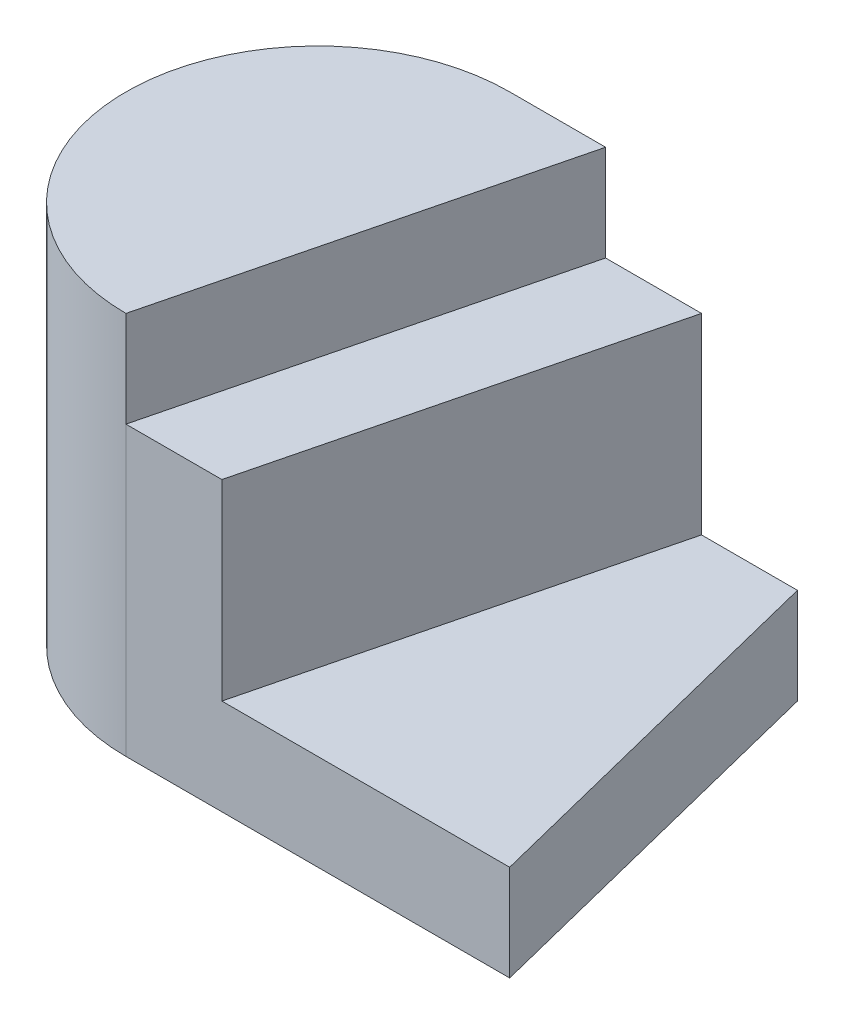
ISO-10303-21;
HEADER;
FILE_DESCRIPTION(('STEP AP214'),'2;1');
FILE_NAME('part.step','',(''),(''),'','','');
FILE_SCHEMA(('AUTOMOTIVE_DESIGN { 1 0 10303 214 1 1 1 1 }'));
ENDSEC;
DATA;
#1=APPLICATION_CONTEXT('core data for automotive mechanical design processes');
#2=APPLICATION_PROTOCOL_DEFINITION('international standard','automotive_design',2000,#1);
#3=PRODUCT_CONTEXT('',#1,'mechanical');
#4=PRODUCT('Part','Part','',(#3));
#5=PRODUCT_RELATED_PRODUCT_CATEGORY('part','',(#4));
#6=PRODUCT_DEFINITION_FORMATION('','',#4);
#7=PRODUCT_DEFINITION_CONTEXT('part definition',#1,'design');
#8=PRODUCT_DEFINITION('design','',#6,#7);
#9=PRODUCT_DEFINITION_SHAPE('','',#8);
#10=(LENGTH_UNIT() NAMED_UNIT(*) SI_UNIT(.MILLI.,.METRE.));
#11=(NAMED_UNIT(*) PLANE_ANGLE_UNIT() SI_UNIT($,.RADIAN.));
#12=(NAMED_UNIT(*) SI_UNIT($,.STERADIAN.) SOLID_ANGLE_UNIT());
#13=UNCERTAINTY_MEASURE_WITH_UNIT(LENGTH_MEASURE(1.E-05),#10,'distance_accuracy_value','');
#14=(GEOMETRIC_REPRESENTATION_CONTEXT(3) GLOBAL_UNCERTAINTY_ASSIGNED_CONTEXT((#13)) GLOBAL_UNIT_ASSIGNED_CONTEXT((#10,
#11,#12)) REPRESENTATION_CONTEXT('',''));
#15=CARTESIAN_POINT('',(0.,0.,0.));
#16=DIRECTION('',(0.,0.,1.));
#17=DIRECTION('',(1.,0.,0.));
#18=AXIS2_PLACEMENT_3D('',#15,#16,#17);
#19=CARTESIAN_POINT('',(-40.,10.,-20.));
#20=DIRECTION('',(0.,1.,0.));
#21=DIRECTION('',(0.,0.,1.));
#22=AXIS2_PLACEMENT_3D('',#19,#20,#21);
#23=PLANE('',#22);
#24=DIRECTION('',(0.242535625036335,0.,-0.970142500145331));
#25=VECTOR('',#24,1.);
#26=CARTESIAN_POINT('',(-30.0000000000001,10.,0.));
#27=LINE('',#26,#25);
#28=CARTESIAN_POINT('',(-30.0000000000001,10.,0.));
#29=VERTEX_POINT('',#28);
#30=CARTESIAN_POINT('',(-20.,10.,-40.));
#31=VERTEX_POINT('',#30);
#32=EDGE_CURVE('E59',#29,#31,#27,.T.);
#33=ORIENTED_EDGE('',*,*,#32,.F.);
#34=DIRECTION('',(1.,0.,0.));
#35=VECTOR('',#34,1.);
#36=CARTESIAN_POINT('',(0.,10.,0.));
#37=LINE('',#36,#35);
#38=CARTESIAN_POINT('',(0.,10.,0.));
#39=VERTEX_POINT('',#38);
#40=EDGE_CURVE('E161',#29,#39,#37,.T.);
#41=ORIENTED_EDGE('',*,*,#40,.T.);
#42=DIRECTION('',(-0.242535625036333,0.,-0.970142500145332));
#43=VECTOR('',#42,1.);
#44=CARTESIAN_POINT('',(0.,10.,0.));
#45=LINE('',#44,#43);
#46=CARTESIAN_POINT('',(-9.99999999999999,10.,-40.));
#47=VERTEX_POINT('',#46);
#48=EDGE_CURVE('E164',#39,#47,#45,.T.);
#49=ORIENTED_EDGE('',*,*,#48,.T.);
#50=DIRECTION('',(-1.,0.,0.));
#51=VECTOR('',#50,1.);
#52=CARTESIAN_POINT('',(-9.99999999999999,10.,-40.));
#53=LINE('',#52,#51);
#54=EDGE_CURVE('E55',#47,#31,#53,.T.);
#55=ORIENTED_EDGE('',*,*,#54,.T.);
#56=EDGE_LOOP('',(#33,#41,#49,#55));
#57=FACE_BOUND('',#56,.T.);
#58=ADVANCED_FACE('F39',(#57),#23,.T.);
#59=CARTESIAN_POINT('',(0.,10.,0.));
#60=DIRECTION('',(0.,0.,-1.));
#61=DIRECTION('',(-1.,0.,0.));
#62=AXIS2_PLACEMENT_3D('',#59,#60,#61);
#63=PLANE('',#62);
#64=DIRECTION('',(1.,0.,0.));
#65=VECTOR('',#64,1.);
#66=CARTESIAN_POINT('',(0.,0.,0.));
#67=LINE('',#66,#65);
#68=CARTESIAN_POINT('',(-40.,0.,0.));
#69=VERTEX_POINT('',#68);
#70=CARTESIAN_POINT('',(0.,0.,0.));
#71=VERTEX_POINT('',#70);
#72=EDGE_CURVE('E160',#69,#71,#67,.T.);
#73=ORIENTED_EDGE('',*,*,#72,.T.);
#74=DIRECTION('',(0.,-1.,0.));
#75=VECTOR('',#74,1.);
#76=CARTESIAN_POINT('',(0.,10.,0.));
#77=LINE('',#76,#75);
#78=EDGE_CURVE('E11',#39,#71,#77,.T.);
#79=ORIENTED_EDGE('',*,*,#78,.F.);
#80=ORIENTED_EDGE('',*,*,#40,.F.);
#81=DIRECTION('',(0.,-1.,0.));
#82=VECTOR('',#81,1.);
#83=CARTESIAN_POINT('',(-30.0000000000001,30.,0.));
#84=LINE('',#83,#82);
#85=CARTESIAN_POINT('',(-30.0000000000001,30.,0.));
#86=VERTEX_POINT('',#85);
#87=EDGE_CURVE('E156',#86,#29,#84,.T.);
#88=ORIENTED_EDGE('',*,*,#87,.F.);
#89=DIRECTION('',(1.,0.,0.));
#90=VECTOR('',#89,1.);
#91=CARTESIAN_POINT('',(-40.,30.,0.));
#92=LINE('',#91,#90);
#93=CARTESIAN_POINT('',(-40.,30.,0.));
#94=VERTEX_POINT('',#93);
#95=EDGE_CURVE('E144',#94,#86,#92,.T.);
#96=ORIENTED_EDGE('',*,*,#95,.F.);
#97=DIRECTION('',(0.,-1.,0.));
#98=VECTOR('',#97,1.);
#99=CARTESIAN_POINT('',(-40.,10.,0.));
#100=LINE('',#99,#98);
#101=EDGE_CURVE('E112',#94,#69,#100,.T.);
#102=ORIENTED_EDGE('',*,*,#101,.T.);
#103=EDGE_LOOP('',(#73,#79,#80,#88,#96,#102));
#104=FACE_BOUND('',#103,.T.);
#105=ADVANCED_FACE('F41',(#104),#63,.F.);
#106=CARTESIAN_POINT('',(0.,10.,0.));
#107=DIRECTION('',(-0.970142500145332,0.,0.242535625036333));
#108=DIRECTION('',(0.242535625036333,0.,0.970142500145332));
#109=AXIS2_PLACEMENT_3D('',#106,#107,#108);
#110=PLANE('',#109);
#111=DIRECTION('',(-0.242535625036333,0.,-0.970142500145332));
#112=VECTOR('',#111,1.);
#113=CARTESIAN_POINT('',(0.,0.,0.));
#114=LINE('',#113,#112);
#115=CARTESIAN_POINT('',(-9.99999999999999,0.,-40.));
#116=VERTEX_POINT('',#115);
#117=EDGE_CURVE('E173',#71,#116,#114,.T.);
#118=ORIENTED_EDGE('',*,*,#117,.T.);
#119=DIRECTION('',(0.,-1.,0.));
#120=VECTOR('',#119,1.);
#121=CARTESIAN_POINT('',(-9.99999999999999,10.,-40.));
#122=LINE('',#121,#120);
#123=EDGE_CURVE('E48',#47,#116,#122,.T.);
#124=ORIENTED_EDGE('',*,*,#123,.F.);
#125=ORIENTED_EDGE('',*,*,#48,.F.);
#126=ORIENTED_EDGE('',*,*,#78,.T.);
#127=EDGE_LOOP('',(#118,#124,#125,#126));
#128=FACE_BOUND('',#127,.T.);
#129=ADVANCED_FACE('F215',(#128),#110,.F.);
#130=CARTESIAN_POINT('',(-9.99999999999999,10.,-40.));
#131=DIRECTION('',(0.,0.,1.));
#132=DIRECTION('',(1.,0.,0.));
#133=AXIS2_PLACEMENT_3D('',#130,#131,#132);
#134=PLANE('',#133);
#135=DIRECTION('',(0.,-1.,0.));
#136=VECTOR('',#135,1.);
#137=CARTESIAN_POINT('',(-40.,10.,-40.));
#138=LINE('',#137,#136);
#139=CARTESIAN_POINT('',(-40.,40.,-40.));
#140=VERTEX_POINT('',#139);
#141=CARTESIAN_POINT('',(-40.,0.,-40.));
#142=VERTEX_POINT('',#141);
#143=EDGE_CURVE('E100',#140,#142,#138,.T.);
#144=ORIENTED_EDGE('',*,*,#143,.F.);
#145=DIRECTION('',(-1.,0.,0.));
#146=VECTOR('',#145,1.);
#147=CARTESIAN_POINT('',(-30.,40.,-40.));
#148=LINE('',#147,#146);
#149=CARTESIAN_POINT('',(-30.,40.,-40.));
#150=VERTEX_POINT('',#149);
#151=EDGE_CURVE('E105',#150,#140,#148,.T.);
#152=ORIENTED_EDGE('',*,*,#151,.F.);
#153=DIRECTION('',(0.,-1.,0.));
#154=VECTOR('',#153,1.);
#155=CARTESIAN_POINT('',(-30.,40.,-40.));
#156=LINE('',#155,#154);
#157=CARTESIAN_POINT('',(-30.,30.,-40.));
#158=VERTEX_POINT('',#157);
#159=EDGE_CURVE('E131',#150,#158,#156,.T.);
#160=ORIENTED_EDGE('',*,*,#159,.T.);
#161=DIRECTION('',(-1.,0.,0.));
#162=VECTOR('',#161,1.);
#163=CARTESIAN_POINT('',(-20.,30.,-40.));
#164=LINE('',#163,#162);
#165=CARTESIAN_POINT('',(-20.,30.,-40.));
#166=VERTEX_POINT('',#165);
#167=EDGE_CURVE('E136',#166,#158,#164,.T.);
#168=ORIENTED_EDGE('',*,*,#167,.F.);
#169=DIRECTION('',(0.,-1.,0.));
#170=VECTOR('',#169,1.);
#171=CARTESIAN_POINT('',(-20.,30.,-40.));
#172=LINE('',#171,#170);
#173=EDGE_CURVE('E150',#166,#31,#172,.T.);
#174=ORIENTED_EDGE('',*,*,#173,.T.);
#175=ORIENTED_EDGE('',*,*,#54,.F.);
#176=ORIENTED_EDGE('',*,*,#123,.T.);
#177=DIRECTION('',(-1.,0.,0.));
#178=VECTOR('',#177,1.);
#179=CARTESIAN_POINT('',(-9.99999999999999,0.,-40.));
#180=LINE('',#179,#178);
#181=EDGE_CURVE('E108',#116,#142,#180,.T.);
#182=ORIENTED_EDGE('',*,*,#181,.T.);
#183=EDGE_LOOP('',(#144,#152,#160,#168,#174,#175,#176,#182));
#184=FACE_BOUND('',#183,.T.);
#185=ADVANCED_FACE('F102',(#184),#134,.F.);
#186=CARTESIAN_POINT('',(-40.,10.,-20.));
#187=DIRECTION('',(0.,-1.,0.));
#188=DIRECTION('',(0.,0.,-1.));
#189=AXIS2_PLACEMENT_3D('',#186,#187,#188);
#190=CYLINDRICAL_SURFACE('',#189,20.);
#191=CARTESIAN_POINT('',(-40.,0.,-20.));
#192=DIRECTION('',(0.,1.,0.));
#193=DIRECTION('',(0.,0.,1.));
#194=AXIS2_PLACEMENT_3D('',#191,#192,#193);
#195=CIRCLE('',#194,20.);
#196=EDGE_CURVE('E165',#142,#69,#195,.T.);
#197=ORIENTED_EDGE('',*,*,#196,.T.);
#198=ORIENTED_EDGE('',*,*,#101,.F.);
#199=DIRECTION('',(0.,-1.,0.));
#200=VECTOR('',#199,1.);
#201=CARTESIAN_POINT('',(-40.,40.,0.));
#202=LINE('',#201,#200);
#203=CARTESIAN_POINT('',(-40.,40.,0.));
#204=VERTEX_POINT('',#203);
#205=EDGE_CURVE('E118',#204,#94,#202,.T.);
#206=ORIENTED_EDGE('',*,*,#205,.F.);
#207=CARTESIAN_POINT('',(-40.,40.,-20.));
#208=DIRECTION('',(0.,1.,0.));
#209=DIRECTION('',(0.,0.,1.));
#210=AXIS2_PLACEMENT_3D('',#207,#208,#209);
#211=CIRCLE('',#210,20.);
#212=EDGE_CURVE('E115',#140,#204,#211,.T.);
#213=ORIENTED_EDGE('',*,*,#212,.F.);
#214=ORIENTED_EDGE('',*,*,#143,.T.);
#215=EDGE_LOOP('',(#197,#198,#206,#213,#214));
#216=FACE_BOUND('',#215,.T.);
#217=ADVANCED_FACE('F116',(#216),#190,.T.);
#218=CARTESIAN_POINT('',(-40.,0.,-20.));
#219=DIRECTION('',(0.,1.,0.));
#220=DIRECTION('',(0.,0.,1.));
#221=AXIS2_PLACEMENT_3D('',#218,#219,#220);
#222=PLANE('',#221);
#223=ORIENTED_EDGE('',*,*,#72,.F.);
#224=ORIENTED_EDGE('',*,*,#196,.F.);
#225=ORIENTED_EDGE('',*,*,#181,.F.);
#226=ORIENTED_EDGE('',*,*,#117,.F.);
#227=EDGE_LOOP('',(#223,#224,#225,#226));
#228=FACE_BOUND('',#227,.T.);
#229=ADVANCED_FACE('F188',(#228),#222,.F.);
#230=CARTESIAN_POINT('',(-30.0000000000001,30.,0.));
#231=DIRECTION('',(-0.970142500145331,0.,-0.242535625036335));
#232=DIRECTION('',(-0.242535625036335,0.,0.970142500145332));
#233=AXIS2_PLACEMENT_3D('',#230,#231,#232);
#234=PLANE('',#233);
#235=ORIENTED_EDGE('',*,*,#32,.T.);
#236=ORIENTED_EDGE('',*,*,#173,.F.);
#237=DIRECTION('',(0.242535625036335,0.,-0.970142500145331));
#238=VECTOR('',#237,1.);
#239=CARTESIAN_POINT('',(-30.0000000000001,30.,0.));
#240=LINE('',#239,#238);
#241=EDGE_CURVE('E147',#86,#166,#240,.T.);
#242=ORIENTED_EDGE('',*,*,#241,.F.);
#243=ORIENTED_EDGE('',*,*,#87,.T.);
#244=EDGE_LOOP('',(#235,#236,#242,#243));
#245=FACE_BOUND('',#244,.T.);
#246=ADVANCED_FACE('F201',(#245),#234,.F.);
#247=CARTESIAN_POINT('',(0.,30.,0.));
#248=DIRECTION('',(0.,1.,0.));
#249=DIRECTION('',(0.,0.,1.));
#250=AXIS2_PLACEMENT_3D('',#247,#248,#249);
#251=PLANE('',#250);
#252=ORIENTED_EDGE('',*,*,#167,.T.);
#253=DIRECTION('',(-0.242535625036333,0.,0.970142500145332));
#254=VECTOR('',#253,1.);
#255=CARTESIAN_POINT('',(-30.,30.,-40.));
#256=LINE('',#255,#254);
#257=EDGE_CURVE('E140',#158,#94,#256,.T.);
#258=ORIENTED_EDGE('',*,*,#257,.T.);
#259=ORIENTED_EDGE('',*,*,#95,.T.);
#260=ORIENTED_EDGE('',*,*,#241,.T.);
#261=EDGE_LOOP('',(#252,#258,#259,#260));
#262=FACE_BOUND('',#261,.T.);
#263=ADVANCED_FACE('F195',(#262),#251,.T.);
#264=CARTESIAN_POINT('',(-30.,40.,-40.));
#265=DIRECTION('',(-0.970142500145332,0.,-0.242535625036333));
#266=DIRECTION('',(-0.242535625036333,0.,0.970142500145332));
#267=AXIS2_PLACEMENT_3D('',#264,#265,#266);
#268=PLANE('',#267);
#269=ORIENTED_EDGE('',*,*,#257,.F.);
#270=ORIENTED_EDGE('',*,*,#159,.F.);
#271=DIRECTION('',(0.242535625036333,0.,-0.970142500145332));
#272=VECTOR('',#271,1.);
#273=CARTESIAN_POINT('',(-30.,40.,-40.));
#274=LINE('',#273,#272);
#275=EDGE_CURVE('E122',#204,#150,#274,.T.);
#276=ORIENTED_EDGE('',*,*,#275,.F.);
#277=ORIENTED_EDGE('',*,*,#205,.T.);
#278=EDGE_LOOP('',(#269,#270,#276,#277));
#279=FACE_BOUND('',#278,.T.);
#280=ADVANCED_FACE('F199',(#279),#268,.F.);
#281=CARTESIAN_POINT('',(-40.,40.,-20.));
#282=DIRECTION('',(0.,1.,0.));
#283=DIRECTION('',(0.,0.,1.));
#284=AXIS2_PLACEMENT_3D('',#281,#282,#283);
#285=PLANE('',#284);
#286=ORIENTED_EDGE('',*,*,#151,.T.);
#287=ORIENTED_EDGE('',*,*,#212,.T.);
#288=ORIENTED_EDGE('',*,*,#275,.T.);
#289=EDGE_LOOP('',(#286,#287,#288));
#290=FACE_BOUND('',#289,.T.);
#291=ADVANCED_FACE('F124',(#290),#285,.T.);
#292=CLOSED_SHELL('',(#58,#105,#129,#185,#217,#229,#246,#263,#280,#291));
#293=MANIFOLD_SOLID_BREP('B2',#292);
#294=ADVANCED_BREP_SHAPE_REPRESENTATION('',(#18,#293),#14);
#295=SHAPE_DEFINITION_REPRESENTATION(#9,#294);
ENDSEC;
END-ISO-10303-21;
